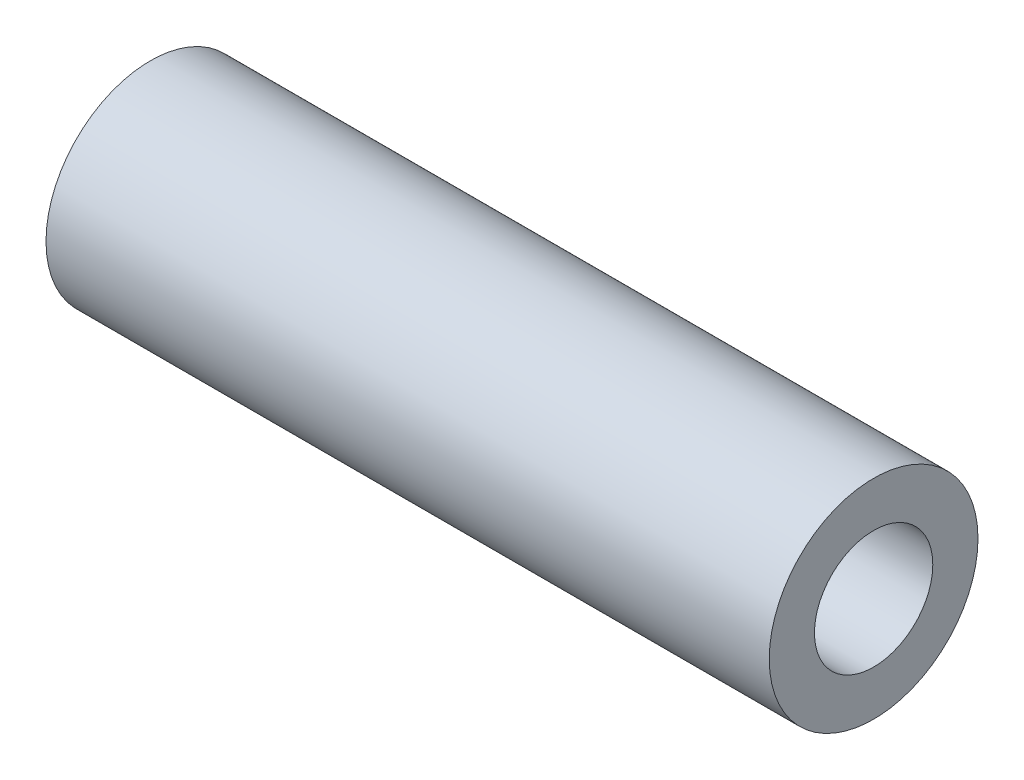
ISO-10303-21;
HEADER;
FILE_DESCRIPTION(('STEP AP214'),'2;1');
FILE_NAME('part.step','',(''),(''),'','','');
FILE_SCHEMA(('AUTOMOTIVE_DESIGN { 1 0 10303 214 1 1 1 1 }'));
ENDSEC;
DATA;
#1=APPLICATION_CONTEXT('core data for automotive mechanical design processes');
#2=APPLICATION_PROTOCOL_DEFINITION('international standard','automotive_design',2000,#1);
#3=PRODUCT_CONTEXT('',#1,'mechanical');
#4=PRODUCT('Part','Part','',(#3));
#5=PRODUCT_RELATED_PRODUCT_CATEGORY('part','',(#4));
#6=PRODUCT_DEFINITION_FORMATION('','',#4);
#7=PRODUCT_DEFINITION_CONTEXT('part definition',#1,'design');
#8=PRODUCT_DEFINITION('design','',#6,#7);
#9=PRODUCT_DEFINITION_SHAPE('','',#8);
#10=(LENGTH_UNIT() NAMED_UNIT(*) SI_UNIT(.MILLI.,.METRE.));
#11=(NAMED_UNIT(*) PLANE_ANGLE_UNIT() SI_UNIT($,.RADIAN.));
#12=(NAMED_UNIT(*) SI_UNIT($,.STERADIAN.) SOLID_ANGLE_UNIT());
#13=UNCERTAINTY_MEASURE_WITH_UNIT(LENGTH_MEASURE(1.E-05),#10,'distance_accuracy_value','');
#14=(GEOMETRIC_REPRESENTATION_CONTEXT(3) GLOBAL_UNCERTAINTY_ASSIGNED_CONTEXT((#13)) GLOBAL_UNIT_ASSIGNED_CONTEXT((#10,
#11,#12)) REPRESENTATION_CONTEXT('',''));
#15=CARTESIAN_POINT('',(0.,0.,0.));
#16=DIRECTION('',(0.,0.,1.));
#17=DIRECTION('',(1.,0.,0.));
#18=AXIS2_PLACEMENT_3D('',#15,#16,#17);
#19=CARTESIAN_POINT('',(22.,0.,0.));
#20=DIRECTION('',(1.,0.,0.));
#21=DIRECTION('',(0.,0.,-1.));
#22=AXIS2_PLACEMENT_3D('',#19,#20,#21);
#23=PLANE('',#22);
#24=CARTESIAN_POINT('',(22.,0.,0.));
#25=DIRECTION('',(1.,0.,0.));
#26=DIRECTION('',(0.,0.,-1.));
#27=AXIS2_PLACEMENT_3D('',#24,#25,#26);
#28=CIRCLE('',#27,3.175);
#29=CARTESIAN_POINT('',(22.,0.,-3.175));
#30=VERTEX_POINT('',#29);
#31=EDGE_CURVE('E10',#30,#30,#28,.T.);
#32=ORIENTED_EDGE('',*,*,#31,.T.);
#33=EDGE_LOOP('',(#32));
#34=FACE_BOUND('',#33,.T.);
#35=CARTESIAN_POINT('',(22.,0.,0.));
#36=DIRECTION('',(1.,0.,0.));
#37=DIRECTION('',(0.,0.,-1.));
#38=AXIS2_PLACEMENT_3D('',#35,#36,#37);
#39=CIRCLE('',#38,1.8);
#40=CARTESIAN_POINT('',(22.,0.,-1.8));
#41=VERTEX_POINT('',#40);
#42=EDGE_CURVE('E42',#41,#41,#39,.T.);
#43=ORIENTED_EDGE('',*,*,#42,.F.);
#44=EDGE_LOOP('',(#43));
#45=FACE_BOUND('',#44,.T.);
#46=ADVANCED_FACE('F31',(#34,#45),#23,.T.);
#47=CARTESIAN_POINT('',(0.,0.,0.));
#48=DIRECTION('',(1.,0.,0.));
#49=DIRECTION('',(0.,0.,-1.));
#50=AXIS2_PLACEMENT_3D('',#47,#48,#49);
#51=PLANE('',#50);
#52=CARTESIAN_POINT('',(0.,0.,0.));
#53=DIRECTION('',(1.,0.,0.));
#54=DIRECTION('',(0.,0.,-1.));
#55=AXIS2_PLACEMENT_3D('',#52,#53,#54);
#56=CIRCLE('',#55,3.175);
#57=CARTESIAN_POINT('',(0.,0.,-3.175));
#58=VERTEX_POINT('',#57);
#59=EDGE_CURVE('E35',#58,#58,#56,.T.);
#60=ORIENTED_EDGE('',*,*,#59,.F.);
#61=EDGE_LOOP('',(#60));
#62=FACE_BOUND('',#61,.T.);
#63=CARTESIAN_POINT('',(0.,0.,0.));
#64=DIRECTION('',(1.,0.,0.));
#65=DIRECTION('',(0.,0.,-1.));
#66=AXIS2_PLACEMENT_3D('',#63,#64,#65);
#67=CIRCLE('',#66,1.8);
#68=CARTESIAN_POINT('',(0.,0.,-1.8));
#69=VERTEX_POINT('',#68);
#70=EDGE_CURVE('E44',#69,#69,#67,.T.);
#71=ORIENTED_EDGE('',*,*,#70,.T.);
#72=EDGE_LOOP('',(#71));
#73=FACE_BOUND('',#72,.T.);
#74=ADVANCED_FACE('F54',(#62,#73),#51,.F.);
#75=CARTESIAN_POINT('',(22.,0.,0.));
#76=DIRECTION('',(-1.,0.,0.));
#77=DIRECTION('',(0.,0.,1.));
#78=AXIS2_PLACEMENT_3D('',#75,#76,#77);
#79=CYLINDRICAL_SURFACE('',#78,3.175);
#80=ORIENTED_EDGE('',*,*,#31,.F.);
#81=EDGE_LOOP('',(#80));
#82=FACE_BOUND('',#81,.T.);
#83=ORIENTED_EDGE('',*,*,#59,.T.);
#84=EDGE_LOOP('',(#83));
#85=FACE_BOUND('',#84,.T.);
#86=ADVANCED_FACE('F33',(#82,#85),#79,.T.);
#87=CARTESIAN_POINT('',(22.,0.,0.));
#88=DIRECTION('',(-1.,0.,0.));
#89=DIRECTION('',(0.,0.,1.));
#90=AXIS2_PLACEMENT_3D('',#87,#88,#89);
#91=CYLINDRICAL_SURFACE('',#90,1.8);
#92=ORIENTED_EDGE('',*,*,#42,.T.);
#93=EDGE_LOOP('',(#92));
#94=FACE_BOUND('',#93,.T.);
#95=ORIENTED_EDGE('',*,*,#70,.F.);
#96=EDGE_LOOP('',(#95));
#97=FACE_BOUND('',#96,.T.);
#98=ADVANCED_FACE('F50',(#94,#97),#91,.F.);
#99=CLOSED_SHELL('',(#46,#74,#86,#98));
#100=MANIFOLD_SOLID_BREP('B2',#99);
#101=ADVANCED_BREP_SHAPE_REPRESENTATION('',(#18,#100),#14);
#102=SHAPE_DEFINITION_REPRESENTATION(#9,#101);
ENDSEC;
END-ISO-10303-21;
